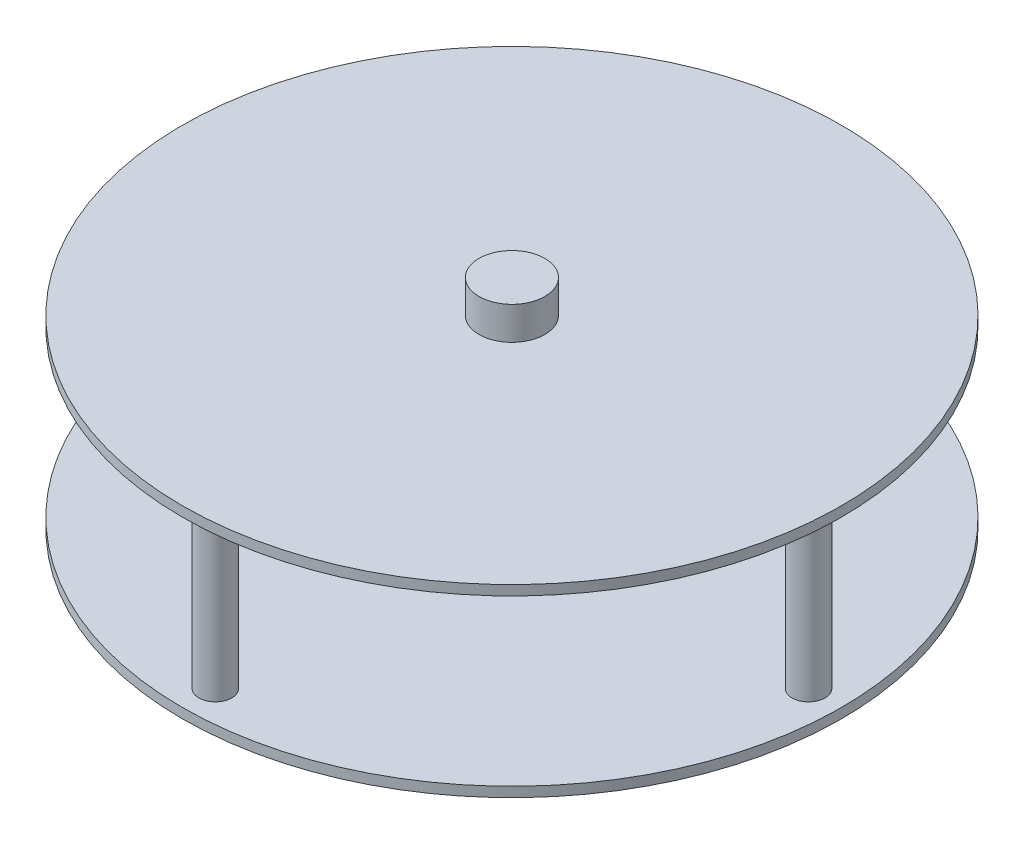
ISO-10303-21;
HEADER;
FILE_DESCRIPTION(('STEP AP214'),'2;1');
FILE_NAME('part.step','',(''),(''),'','','');
FILE_SCHEMA(('AUTOMOTIVE_DESIGN { 1 0 10303 214 1 1 1 1 }'));
ENDSEC;
DATA;
#1=APPLICATION_CONTEXT('core data for automotive mechanical design processes');
#2=APPLICATION_PROTOCOL_DEFINITION('international standard','automotive_design',2000,#1);
#3=PRODUCT_CONTEXT('',#1,'mechanical');
#4=PRODUCT('Part','Part','',(#3));
#5=PRODUCT_RELATED_PRODUCT_CATEGORY('part','',(#4));
#6=PRODUCT_DEFINITION_FORMATION('','',#4);
#7=PRODUCT_DEFINITION_CONTEXT('part definition',#1,'design');
#8=PRODUCT_DEFINITION('design','',#6,#7);
#9=PRODUCT_DEFINITION_SHAPE('','',#8);
#10=(LENGTH_UNIT() NAMED_UNIT(*) SI_UNIT(.MILLI.,.METRE.));
#11=(NAMED_UNIT(*) PLANE_ANGLE_UNIT() SI_UNIT($,.RADIAN.));
#12=(NAMED_UNIT(*) SI_UNIT($,.STERADIAN.) SOLID_ANGLE_UNIT());
#13=UNCERTAINTY_MEASURE_WITH_UNIT(LENGTH_MEASURE(1.E-05),#10,'distance_accuracy_value','');
#14=(GEOMETRIC_REPRESENTATION_CONTEXT(3) GLOBAL_UNCERTAINTY_ASSIGNED_CONTEXT((#13)) GLOBAL_UNIT_ASSIGNED_CONTEXT((#10,
#11,#12)) REPRESENTATION_CONTEXT('',''));
#15=CARTESIAN_POINT('',(0.,0.,0.));
#16=DIRECTION('',(0.,0.,1.));
#17=DIRECTION('',(1.,0.,0.));
#18=AXIS2_PLACEMENT_3D('',#15,#16,#17);
#19=CARTESIAN_POINT('',(0.,3.,0.));
#20=DIRECTION('',(0.,-1.,0.));
#21=DIRECTION('',(0.,0.,-1.));
#22=AXIS2_PLACEMENT_3D('',#19,#20,#21);
#23=CYLINDRICAL_SURFACE('',#22,100.);
#24=CARTESIAN_POINT('',(0.,3.,0.));
#25=DIRECTION('',(0.,1.,0.));
#26=DIRECTION('',(0.,0.,1.));
#27=AXIS2_PLACEMENT_3D('',#24,#25,#26);
#28=CIRCLE('',#27,100.);
#29=CARTESIAN_POINT('',(0.,3.,100.));
#30=VERTEX_POINT('',#29);
#31=EDGE_CURVE('E48',#30,#30,#28,.T.);
#32=ORIENTED_EDGE('',*,*,#31,.F.);
#33=EDGE_LOOP('',(#32));
#34=FACE_BOUND('',#33,.T.);
#35=CARTESIAN_POINT('',(0.,0.,0.));
#36=DIRECTION('',(0.,1.,0.));
#37=DIRECTION('',(0.,0.,1.));
#38=AXIS2_PLACEMENT_3D('',#35,#36,#37);
#39=CIRCLE('',#38,100.);
#40=CARTESIAN_POINT('',(0.,0.,100.));
#41=VERTEX_POINT('',#40);
#42=EDGE_CURVE('E53',#41,#41,#39,.T.);
#43=ORIENTED_EDGE('',*,*,#42,.T.);
#44=EDGE_LOOP('',(#43));
#45=FACE_BOUND('',#44,.T.);
#46=ADVANCED_FACE('F41',(#34,#45),#23,.T.);
#47=CARTESIAN_POINT('',(0.,3.,0.));
#48=DIRECTION('',(0.,1.,0.));
#49=DIRECTION('',(0.,0.,1.));
#50=AXIS2_PLACEMENT_3D('',#47,#48,#49);
#51=PLANE('',#50);
#52=CARTESIAN_POINT('',(0.,3.,90.));
#53=DIRECTION('',(0.,1.,0.));
#54=DIRECTION('',(0.,0.,1.));
#55=AXIS2_PLACEMENT_3D('',#52,#53,#54);
#56=CIRCLE('',#55,5.);
#57=CARTESIAN_POINT('',(0.,3.,95.));
#58=VERTEX_POINT('',#57);
#59=EDGE_CURVE('E81',#58,#58,#56,.T.);
#60=ORIENTED_EDGE('',*,*,#59,.F.);
#61=EDGE_LOOP('',(#60));
#62=FACE_BOUND('',#61,.T.);
#63=CARTESIAN_POINT('',(0.,3.,-90.));
#64=DIRECTION('',(0.,1.,0.));
#65=DIRECTION('',(0.,0.,1.));
#66=AXIS2_PLACEMENT_3D('',#63,#64,#65);
#67=CIRCLE('',#66,5.);
#68=CARTESIAN_POINT('',(0.,3.,-85.));
#69=VERTEX_POINT('',#68);
#70=EDGE_CURVE('E73',#69,#69,#67,.T.);
#71=ORIENTED_EDGE('',*,*,#70,.F.);
#72=EDGE_LOOP('',(#71));
#73=FACE_BOUND('',#72,.T.);
#74=CARTESIAN_POINT('',(90.,3.,0.));
#75=DIRECTION('',(0.,1.,0.));
#76=DIRECTION('',(0.,0.,1.));
#77=AXIS2_PLACEMENT_3D('',#74,#75,#76);
#78=CIRCLE('',#77,5.);
#79=CARTESIAN_POINT('',(90.,3.,5.));
#80=VERTEX_POINT('',#79);
#81=EDGE_CURVE('E65',#80,#80,#78,.T.);
#82=ORIENTED_EDGE('',*,*,#81,.F.);
#83=EDGE_LOOP('',(#82));
#84=FACE_BOUND('',#83,.T.);
#85=CARTESIAN_POINT('',(-90.,3.,0.));
#86=DIRECTION('',(0.,1.,0.));
#87=DIRECTION('',(0.,0.,1.));
#88=AXIS2_PLACEMENT_3D('',#85,#86,#87);
#89=CIRCLE('',#88,5.);
#90=CARTESIAN_POINT('',(-90.,3.,5.));
#91=VERTEX_POINT('',#90);
#92=EDGE_CURVE('E61',#91,#91,#89,.T.);
#93=ORIENTED_EDGE('',*,*,#92,.F.);
#94=EDGE_LOOP('',(#93));
#95=FACE_BOUND('',#94,.T.);
#96=ORIENTED_EDGE('',*,*,#31,.T.);
#97=EDGE_LOOP('',(#96));
#98=FACE_BOUND('',#97,.T.);
#99=ADVANCED_FACE('F121',(#62,#73,#84,#95,#98),#51,.T.);
#100=CARTESIAN_POINT('',(0.,0.,0.));
#101=DIRECTION('',(0.,1.,0.));
#102=DIRECTION('',(0.,0.,1.));
#103=AXIS2_PLACEMENT_3D('',#100,#101,#102);
#104=PLANE('',#103);
#105=ORIENTED_EDGE('',*,*,#42,.F.);
#106=EDGE_LOOP('',(#105));
#107=FACE_BOUND('',#106,.T.);
#108=ADVANCED_FACE('F126',(#107),#104,.F.);
#109=CARTESIAN_POINT('',(-90.,53.,0.));
#110=DIRECTION('',(0.,-1.,0.));
#111=DIRECTION('',(0.,0.,-1.));
#112=AXIS2_PLACEMENT_3D('',#109,#110,#111);
#113=CYLINDRICAL_SURFACE('',#112,5.);
#114=CARTESIAN_POINT('',(-90.,53.,0.));
#115=DIRECTION('',(0.,1.,0.));
#116=DIRECTION('',(0.,0.,1.));
#117=AXIS2_PLACEMENT_3D('',#114,#115,#116);
#118=CIRCLE('',#117,5.);
#119=CARTESIAN_POINT('',(-90.,53.,5.));
#120=VERTEX_POINT('',#119);
#121=EDGE_CURVE('E59',#120,#120,#118,.T.);
#122=ORIENTED_EDGE('',*,*,#121,.F.);
#123=EDGE_LOOP('',(#122));
#124=FACE_BOUND('',#123,.T.);
#125=ORIENTED_EDGE('',*,*,#92,.T.);
#126=EDGE_LOOP('',(#125));
#127=FACE_BOUND('',#126,.T.);
#128=ADVANCED_FACE('F133',(#124,#127),#113,.T.);
#129=CARTESIAN_POINT('',(90.,53.,0.));
#130=DIRECTION('',(0.,-1.,0.));
#131=DIRECTION('',(0.,0.,-1.));
#132=AXIS2_PLACEMENT_3D('',#129,#130,#131);
#133=CYLINDRICAL_SURFACE('',#132,5.);
#134=CARTESIAN_POINT('',(90.,53.,0.));
#135=DIRECTION('',(0.,1.,0.));
#136=DIRECTION('',(0.,0.,1.));
#137=AXIS2_PLACEMENT_3D('',#134,#135,#136);
#138=CIRCLE('',#137,5.);
#139=CARTESIAN_POINT('',(90.,53.,5.));
#140=VERTEX_POINT('',#139);
#141=EDGE_CURVE('E69',#140,#140,#138,.T.);
#142=ORIENTED_EDGE('',*,*,#141,.F.);
#143=EDGE_LOOP('',(#142));
#144=FACE_BOUND('',#143,.T.);
#145=ORIENTED_EDGE('',*,*,#81,.T.);
#146=EDGE_LOOP('',(#145));
#147=FACE_BOUND('',#146,.T.);
#148=ADVANCED_FACE('F137',(#144,#147),#133,.T.);
#149=CARTESIAN_POINT('',(0.,53.,-90.));
#150=DIRECTION('',(0.,-1.,0.));
#151=DIRECTION('',(0.,0.,-1.));
#152=AXIS2_PLACEMENT_3D('',#149,#150,#151);
#153=CYLINDRICAL_SURFACE('',#152,5.);
#154=CARTESIAN_POINT('',(0.,53.,-90.));
#155=DIRECTION('',(0.,1.,0.));
#156=DIRECTION('',(0.,0.,1.));
#157=AXIS2_PLACEMENT_3D('',#154,#155,#156);
#158=CIRCLE('',#157,5.);
#159=CARTESIAN_POINT('',(0.,53.,-85.));
#160=VERTEX_POINT('',#159);
#161=EDGE_CURVE('E77',#160,#160,#158,.T.);
#162=ORIENTED_EDGE('',*,*,#161,.F.);
#163=EDGE_LOOP('',(#162));
#164=FACE_BOUND('',#163,.T.);
#165=ORIENTED_EDGE('',*,*,#70,.T.);
#166=EDGE_LOOP('',(#165));
#167=FACE_BOUND('',#166,.T.);
#168=ADVANCED_FACE('F143',(#164,#167),#153,.T.);
#169=CARTESIAN_POINT('',(0.,53.,90.));
#170=DIRECTION('',(0.,-1.,0.));
#171=DIRECTION('',(0.,0.,-1.));
#172=AXIS2_PLACEMENT_3D('',#169,#170,#171);
#173=CYLINDRICAL_SURFACE('',#172,5.);
#174=CARTESIAN_POINT('',(0.,53.,90.));
#175=DIRECTION('',(0.,1.,0.));
#176=DIRECTION('',(0.,0.,1.));
#177=AXIS2_PLACEMENT_3D('',#174,#175,#176);
#178=CIRCLE('',#177,5.);
#179=CARTESIAN_POINT('',(0.,53.,95.));
#180=VERTEX_POINT('',#179);
#181=EDGE_CURVE('E85',#180,#180,#178,.T.);
#182=ORIENTED_EDGE('',*,*,#181,.F.);
#183=EDGE_LOOP('',(#182));
#184=FACE_BOUND('',#183,.T.);
#185=ORIENTED_EDGE('',*,*,#59,.T.);
#186=EDGE_LOOP('',(#185));
#187=FACE_BOUND('',#186,.T.);
#188=ADVANCED_FACE('F147',(#184,#187),#173,.T.);
#189=CARTESIAN_POINT('',(0.,53.,0.));
#190=DIRECTION('',(0.,1.,0.));
#191=DIRECTION('',(0.,0.,1.));
#192=AXIS2_PLACEMENT_3D('',#189,#190,#191);
#193=CYLINDRICAL_SURFACE('',#192,100.);
#194=CARTESIAN_POINT('',(0.,53.,0.));
#195=DIRECTION('',(0.,1.,0.));
#196=DIRECTION('',(0.,0.,1.));
#197=AXIS2_PLACEMENT_3D('',#194,#195,#196);
#198=CIRCLE('',#197,100.);
#199=CARTESIAN_POINT('',(0.,53.,100.));
#200=VERTEX_POINT('',#199);
#201=EDGE_CURVE('E89',#200,#200,#198,.T.);
#202=ORIENTED_EDGE('',*,*,#201,.T.);
#203=EDGE_LOOP('',(#202));
#204=FACE_BOUND('',#203,.T.);
#205=CARTESIAN_POINT('',(0.,56.,0.));
#206=DIRECTION('',(0.,1.,0.));
#207=DIRECTION('',(0.,0.,1.));
#208=AXIS2_PLACEMENT_3D('',#205,#206,#207);
#209=CIRCLE('',#208,100.);
#210=CARTESIAN_POINT('',(0.,56.,100.));
#211=VERTEX_POINT('',#210);
#212=EDGE_CURVE('E93',#211,#211,#209,.T.);
#213=ORIENTED_EDGE('',*,*,#212,.F.);
#214=EDGE_LOOP('',(#213));
#215=FACE_BOUND('',#214,.T.);
#216=ADVANCED_FACE('F151',(#204,#215),#193,.T.);
#217=CARTESIAN_POINT('',(0.,53.,0.));
#218=DIRECTION('',(0.,-1.,0.));
#219=DIRECTION('',(0.,0.,1.));
#220=AXIS2_PLACEMENT_3D('',#217,#218,#219);
#221=PLANE('',#220);
#222=ORIENTED_EDGE('',*,*,#121,.T.);
#223=EDGE_LOOP('',(#222));
#224=FACE_BOUND('',#223,.T.);
#225=ORIENTED_EDGE('',*,*,#141,.T.);
#226=EDGE_LOOP('',(#225));
#227=FACE_BOUND('',#226,.T.);
#228=ORIENTED_EDGE('',*,*,#161,.T.);
#229=EDGE_LOOP('',(#228));
#230=FACE_BOUND('',#229,.T.);
#231=ORIENTED_EDGE('',*,*,#181,.T.);
#232=EDGE_LOOP('',(#231));
#233=FACE_BOUND('',#232,.T.);
#234=ORIENTED_EDGE('',*,*,#201,.F.);
#235=EDGE_LOOP('',(#234));
#236=FACE_BOUND('',#235,.T.);
#237=ADVANCED_FACE('F116',(#224,#227,#230,#233,#236),#221,.T.);
#238=CARTESIAN_POINT('',(0.,56.,0.));
#239=DIRECTION('',(0.,-1.,0.));
#240=DIRECTION('',(0.,0.,1.));
#241=AXIS2_PLACEMENT_3D('',#238,#239,#240);
#242=PLANE('',#241);
#243=CARTESIAN_POINT('',(0.,56.,0.));
#244=DIRECTION('',(0.,-1.,0.));
#245=DIRECTION('',(0.,0.,-1.));
#246=AXIS2_PLACEMENT_3D('',#243,#244,#245);
#247=CIRCLE('',#246,10.);
#248=CARTESIAN_POINT('',(0.,56.,-10.));
#249=VERTEX_POINT('',#248);
#250=EDGE_CURVE('E10',#249,#249,#247,.F.);
#251=ORIENTED_EDGE('',*,*,#250,.F.);
#252=EDGE_LOOP('',(#251));
#253=FACE_BOUND('',#252,.T.);
#254=ORIENTED_EDGE('',*,*,#212,.T.);
#255=EDGE_LOOP('',(#254));
#256=FACE_BOUND('',#255,.T.);
#257=ADVANCED_FACE('F109',(#253,#256),#242,.F.);
#258=CARTESIAN_POINT('',(0.,66.,0.));
#259=DIRECTION('',(0.,-1.,0.));
#260=DIRECTION('',(0.,0.,-1.));
#261=AXIS2_PLACEMENT_3D('',#258,#259,#260);
#262=CYLINDRICAL_SURFACE('',#261,10.);
#263=CARTESIAN_POINT('',(0.,66.,0.));
#264=DIRECTION('',(0.,1.,0.));
#265=DIRECTION('',(0.,0.,1.));
#266=AXIS2_PLACEMENT_3D('',#263,#264,#265);
#267=CIRCLE('',#266,10.);
#268=CARTESIAN_POINT('',(0.,66.,10.));
#269=VERTEX_POINT('',#268);
#270=EDGE_CURVE('E97',#269,#269,#267,.T.);
#271=ORIENTED_EDGE('',*,*,#270,.F.);
#272=EDGE_LOOP('',(#271));
#273=FACE_BOUND('',#272,.T.);
#274=ORIENTED_EDGE('',*,*,#250,.T.);
#275=EDGE_LOOP('',(#274));
#276=FACE_BOUND('',#275,.T.);
#277=ADVANCED_FACE('F107',(#273,#276),#262,.T.);
#278=CARTESIAN_POINT('',(0.,66.,0.));
#279=DIRECTION('',(0.,1.,0.));
#280=DIRECTION('',(0.,0.,1.));
#281=AXIS2_PLACEMENT_3D('',#278,#279,#280);
#282=PLANE('',#281);
#283=ORIENTED_EDGE('',*,*,#270,.T.);
#284=EDGE_LOOP('',(#283));
#285=FACE_BOUND('',#284,.T.);
#286=ADVANCED_FACE('F105',(#285),#282,.T.);
#287=CLOSED_SHELL('',(#46,#99,#108,#128,#148,#168,#188,#216,#237,#257,#277,#286));
#288=MANIFOLD_SOLID_BREP('B2',#287);
#289=ADVANCED_BREP_SHAPE_REPRESENTATION('',(#18,#288),#14);
#290=SHAPE_DEFINITION_REPRESENTATION(#9,#289);
ENDSEC;
END-ISO-10303-21;
